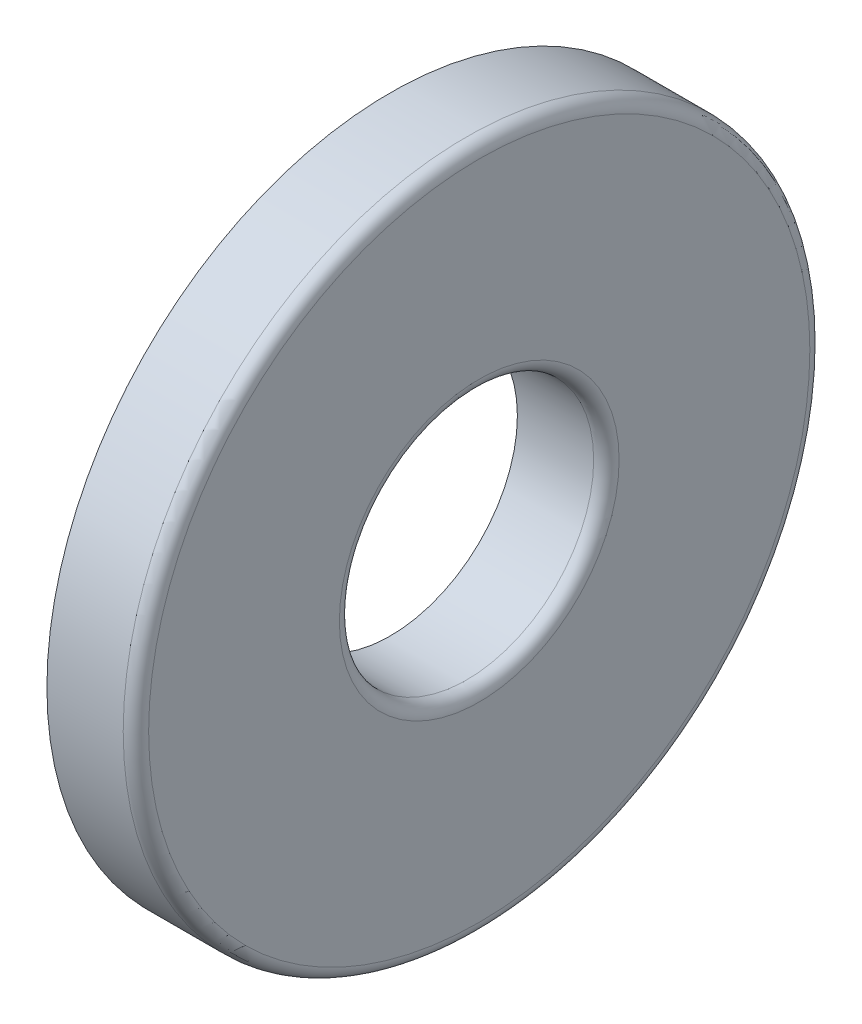
ISO-10303-21;
HEADER;
FILE_DESCRIPTION(('STEP AP214'),'2;1');
FILE_NAME('part.step','',(''),(''),'','','');
FILE_SCHEMA(('AUTOMOTIVE_DESIGN { 1 0 10303 214 1 1 1 1 }'));
ENDSEC;
DATA;
#1=APPLICATION_CONTEXT('core data for automotive mechanical design processes');
#2=APPLICATION_PROTOCOL_DEFINITION('international standard','automotive_design',2000,#1);
#3=PRODUCT_CONTEXT('',#1,'mechanical');
#4=PRODUCT('Part','Part','',(#3));
#5=PRODUCT_RELATED_PRODUCT_CATEGORY('part','',(#4));
#6=PRODUCT_DEFINITION_FORMATION('','',#4);
#7=PRODUCT_DEFINITION_CONTEXT('part definition',#1,'design');
#8=PRODUCT_DEFINITION('design','',#6,#7);
#9=PRODUCT_DEFINITION_SHAPE('','',#8);
#10=(LENGTH_UNIT() NAMED_UNIT(*) SI_UNIT(.MILLI.,.METRE.));
#11=(NAMED_UNIT(*) PLANE_ANGLE_UNIT() SI_UNIT($,.RADIAN.));
#12=(NAMED_UNIT(*) SI_UNIT($,.STERADIAN.) SOLID_ANGLE_UNIT());
#13=UNCERTAINTY_MEASURE_WITH_UNIT(LENGTH_MEASURE(1.E-05),#10,'distance_accuracy_value','');
#14=(GEOMETRIC_REPRESENTATION_CONTEXT(3) GLOBAL_UNCERTAINTY_ASSIGNED_CONTEXT((#13)) GLOBAL_UNIT_ASSIGNED_CONTEXT((#10,
#11,#12)) REPRESENTATION_CONTEXT('',''));
#15=CARTESIAN_POINT('',(0.,0.,0.));
#16=DIRECTION('',(0.,0.,1.));
#17=DIRECTION('',(1.,0.,0.));
#18=AXIS2_PLACEMENT_3D('',#15,#16,#17);
#19=CARTESIAN_POINT('',(3.5,13.5,0.));
#20=DIRECTION('',(1.,0.,0.));
#21=DIRECTION('',(0.,0.,-1.));
#22=AXIS2_PLACEMENT_3D('',#19,#20,#21);
#23=PLANE('',#22);
#24=CARTESIAN_POINT('',(3.5,0.,0.));
#25=DIRECTION('',(1.,0.,0.));
#26=DIRECTION('',(0.,0.,-1.));
#27=AXIS2_PLACEMENT_3D('',#24,#25,#26);
#28=CIRCLE('',#27,5.5);
#29=CARTESIAN_POINT('',(3.5,0.,-5.5));
#30=VERTEX_POINT('',#29);
#31=EDGE_CURVE('E10',#30,#30,#28,.F.);
#32=ORIENTED_EDGE('',*,*,#31,.T.);
#33=EDGE_LOOP('',(#32));
#34=FACE_BOUND('',#33,.T.);
#35=CARTESIAN_POINT('',(3.5,0.,0.));
#36=DIRECTION('',(1.,0.,0.));
#37=DIRECTION('',(0.,0.,-1.));
#38=AXIS2_PLACEMENT_3D('',#35,#36,#37);
#39=CIRCLE('',#38,13.);
#40=CARTESIAN_POINT('',(3.5,0.,-13.));
#41=VERTEX_POINT('',#40);
#42=EDGE_CURVE('E39',#41,#41,#39,.T.);
#43=ORIENTED_EDGE('',*,*,#42,.T.);
#44=EDGE_LOOP('',(#43));
#45=FACE_BOUND('',#44,.T.);
#46=ADVANCED_FACE('F29',(#34,#45),#23,.T.);
#47=CARTESIAN_POINT('',(-2.49999999999997,0.,0.));
#48=DIRECTION('',(-1.,0.,0.));
#49=DIRECTION('',(0.,0.,1.));
#50=AXIS2_PLACEMENT_3D('',#47,#48,#49);
#51=CYLINDRICAL_SURFACE('',#50,13.5);
#52=CARTESIAN_POINT('',(3.,0.,0.));
#53=DIRECTION('',(1.,0.,0.));
#54=DIRECTION('',(0.,0.,-1.));
#55=AXIS2_PLACEMENT_3D('',#52,#53,#54);
#56=CIRCLE('',#55,13.5);
#57=CARTESIAN_POINT('',(3.,0.,-13.5));
#58=VERTEX_POINT('',#57);
#59=EDGE_CURVE('E43',#58,#58,#56,.F.);
#60=ORIENTED_EDGE('',*,*,#59,.T.);
#61=EDGE_LOOP('',(#60));
#62=FACE_BOUND('',#61,.T.);
#63=CARTESIAN_POINT('',(0.,0.,0.));
#64=DIRECTION('',(-1.,0.,0.));
#65=DIRECTION('',(0.,0.,1.));
#66=AXIS2_PLACEMENT_3D('',#63,#64,#65);
#67=CIRCLE('',#66,13.5);
#68=CARTESIAN_POINT('',(0.,0.,13.5));
#69=VERTEX_POINT('',#68);
#70=EDGE_CURVE('E48',#69,#69,#67,.T.);
#71=ORIENTED_EDGE('',*,*,#70,.F.);
#72=EDGE_LOOP('',(#71));
#73=FACE_BOUND('',#72,.T.);
#74=ADVANCED_FACE('F78',(#62,#73),#51,.T.);
#75=CARTESIAN_POINT('',(0.,10.6583123951777,0.));
#76=DIRECTION('',(-1.,0.,0.));
#77=DIRECTION('',(0.,0.,1.));
#78=AXIS2_PLACEMENT_3D('',#75,#76,#77);
#79=PLANE('',#78);
#80=ORIENTED_EDGE('',*,*,#70,.T.);
#81=EDGE_LOOP('',(#80));
#82=FACE_BOUND('',#81,.T.);
#83=CARTESIAN_POINT('',(0.,0.,0.));
#84=DIRECTION('',(-1.,0.,0.));
#85=DIRECTION('',(0.,0.,1.));
#86=AXIS2_PLACEMENT_3D('',#83,#84,#85);
#87=CIRCLE('',#86,10.6583123951777);
#88=CARTESIAN_POINT('',(0.,0.,10.6583123951777));
#89=VERTEX_POINT('',#88);
#90=EDGE_CURVE('E51',#89,#89,#87,.T.);
#91=ORIENTED_EDGE('',*,*,#90,.F.);
#92=EDGE_LOOP('',(#91));
#93=FACE_BOUND('',#92,.T.);
#94=ADVANCED_FACE('F82',(#82,#93),#79,.T.);
#95=CARTESIAN_POINT('',(-2.5,0.,0.));
#96=DIRECTION('',(-1.,0.,0.));
#97=DIRECTION('',(0.,0.,1.));
#98=AXIS2_PLACEMENT_3D('',#95,#96,#97);
#99=TOROIDAL_SURFACE('',#98,9.,3.);
#100=ORIENTED_EDGE('',*,*,#90,.T.);
#101=EDGE_LOOP('',(#100));
#102=FACE_BOUND('',#101,.T.);
#103=CARTESIAN_POINT('',(0.,0.,0.));
#104=DIRECTION('',(-1.,0.,0.));
#105=DIRECTION('',(0.,0.,1.));
#106=AXIS2_PLACEMENT_3D('',#103,#104,#105);
#107=CIRCLE('',#106,7.3416876048223);
#108=CARTESIAN_POINT('',(0.,0.,7.3416876048223));
#109=VERTEX_POINT('',#108);
#110=EDGE_CURVE('E54',#109,#109,#107,.T.);
#111=ORIENTED_EDGE('',*,*,#110,.F.);
#112=EDGE_LOOP('',(#111));
#113=FACE_BOUND('',#112,.T.);
#114=ADVANCED_FACE('F93',(#102,#113),#99,.F.);
#115=CARTESIAN_POINT('',(0.,0.,0.));
#116=DIRECTION('',(-1.,0.,0.));
#117=DIRECTION('',(0.,0.,1.));
#118=AXIS2_PLACEMENT_3D('',#115,#116,#117);
#119=PLANE('',#118);
#120=CARTESIAN_POINT('',(0.,0.,0.));
#121=DIRECTION('',(1.,0.,0.));
#122=DIRECTION('',(0.,0.,-1.));
#123=AXIS2_PLACEMENT_3D('',#120,#121,#122);
#124=CIRCLE('',#123,5.);
#125=CARTESIAN_POINT('',(0.,0.,-5.));
#126=VERTEX_POINT('',#125);
#127=EDGE_CURVE('E57',#126,#126,#124,.T.);
#128=ORIENTED_EDGE('',*,*,#127,.T.);
#129=EDGE_LOOP('',(#128));
#130=FACE_BOUND('',#129,.T.);
#131=ORIENTED_EDGE('',*,*,#110,.T.);
#132=EDGE_LOOP('',(#131));
#133=FACE_BOUND('',#132,.T.);
#134=ADVANCED_FACE('F61',(#130,#133),#119,.T.);
#135=CARTESIAN_POINT('',(3.,0.,0.));
#136=DIRECTION('',(1.,0.,0.));
#137=DIRECTION('',(0.,0.,-1.));
#138=AXIS2_PLACEMENT_3D('',#135,#136,#137);
#139=TOROIDAL_SURFACE('',#138,13.,0.5);
#140=ORIENTED_EDGE('',*,*,#42,.F.);
#141=EDGE_LOOP('',(#140));
#142=FACE_BOUND('',#141,.T.);
#143=ORIENTED_EDGE('',*,*,#59,.F.);
#144=EDGE_LOOP('',(#143));
#145=FACE_BOUND('',#144,.T.);
#146=ADVANCED_FACE('F67',(#142,#145),#139,.T.);
#147=CARTESIAN_POINT('',(0.,0.,0.));
#148=DIRECTION('',(1.,0.,0.));
#149=DIRECTION('',(0.,0.,-1.));
#150=AXIS2_PLACEMENT_3D('',#147,#148,#149);
#151=CYLINDRICAL_SURFACE('',#150,5.);
#152=CARTESIAN_POINT('',(3.,0.,0.));
#153=DIRECTION('',(1.,0.,0.));
#154=DIRECTION('',(0.,0.,-1.));
#155=AXIS2_PLACEMENT_3D('',#152,#153,#154);
#156=CIRCLE('',#155,5.);
#157=CARTESIAN_POINT('',(3.,0.,-5.));
#158=VERTEX_POINT('',#157);
#159=EDGE_CURVE('E35',#158,#158,#156,.T.);
#160=ORIENTED_EDGE('',*,*,#159,.T.);
#161=EDGE_LOOP('',(#160));
#162=FACE_BOUND('',#161,.T.);
#163=ORIENTED_EDGE('',*,*,#127,.F.);
#164=EDGE_LOOP('',(#163));
#165=FACE_BOUND('',#164,.T.);
#166=ADVANCED_FACE('F64',(#162,#165),#151,.F.);
#167=CARTESIAN_POINT('',(3.,0.,0.));
#168=DIRECTION('',(1.,0.,0.));
#169=DIRECTION('',(0.,0.,-1.));
#170=AXIS2_PLACEMENT_3D('',#167,#168,#169);
#171=TOROIDAL_SURFACE('',#170,5.5,0.5);
#172=ORIENTED_EDGE('',*,*,#31,.F.);
#173=EDGE_LOOP('',(#172));
#174=FACE_BOUND('',#173,.T.);
#175=ORIENTED_EDGE('',*,*,#159,.F.);
#176=EDGE_LOOP('',(#175));
#177=FACE_BOUND('',#176,.T.);
#178=ADVANCED_FACE('F66',(#174,#177),#171,.T.);
#179=CLOSED_SHELL('',(#46,#74,#94,#114,#134,#146,#166,#178));
#180=MANIFOLD_SOLID_BREP('B2',#179);
#181=ADVANCED_BREP_SHAPE_REPRESENTATION('',(#18,#180),#14);
#182=SHAPE_DEFINITION_REPRESENTATION(#9,#181);
ENDSEC;
END-ISO-10303-21;
